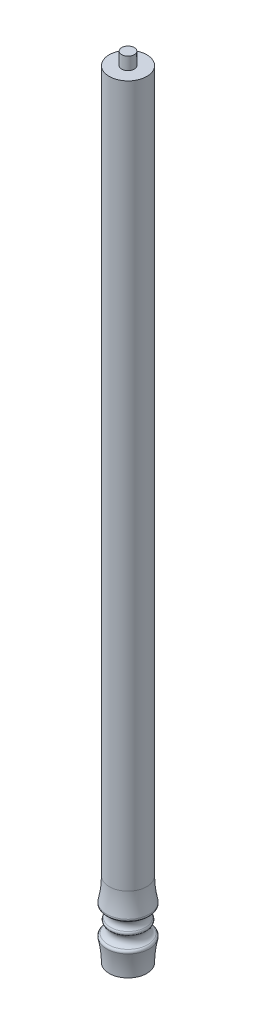
ISO-10303-21;
HEADER;
FILE_DESCRIPTION(('STEP AP214'),'2;1');
FILE_NAME('part.step','',(''),(''),'','','');
FILE_SCHEMA(('AUTOMOTIVE_DESIGN { 1 0 10303 214 1 1 1 1 }'));
ENDSEC;
DATA;
#1=APPLICATION_CONTEXT('core data for automotive mechanical design processes');
#2=APPLICATION_PROTOCOL_DEFINITION('international standard','automotive_design',2000,#1);
#3=PRODUCT_CONTEXT('',#1,'mechanical');
#4=PRODUCT('Part','Part','',(#3));
#5=PRODUCT_RELATED_PRODUCT_CATEGORY('part','',(#4));
#6=PRODUCT_DEFINITION_FORMATION('','',#4);
#7=PRODUCT_DEFINITION_CONTEXT('part definition',#1,'design');
#8=PRODUCT_DEFINITION('design','',#6,#7);
#9=PRODUCT_DEFINITION_SHAPE('','',#8);
#10=(LENGTH_UNIT() NAMED_UNIT(*) SI_UNIT(.MILLI.,.METRE.));
#11=(NAMED_UNIT(*) PLANE_ANGLE_UNIT() SI_UNIT($,.RADIAN.));
#12=(NAMED_UNIT(*) SI_UNIT($,.STERADIAN.) SOLID_ANGLE_UNIT());
#13=UNCERTAINTY_MEASURE_WITH_UNIT(LENGTH_MEASURE(1.E-05),#10,'distance_accuracy_value','');
#14=(GEOMETRIC_REPRESENTATION_CONTEXT(3) GLOBAL_UNCERTAINTY_ASSIGNED_CONTEXT((#13)) GLOBAL_UNIT_ASSIGNED_CONTEXT((#10,
#11,#12)) REPRESENTATION_CONTEXT('',''));
#15=CARTESIAN_POINT('',(0.,0.,0.));
#16=DIRECTION('',(0.,0.,1.));
#17=DIRECTION('',(1.,0.,0.));
#18=AXIS2_PLACEMENT_3D('',#15,#16,#17);
#19=CARTESIAN_POINT('',(6.35,800.1,0.));
#20=DIRECTION('',(0.,1.,0.));
#21=DIRECTION('',(0.,0.,1.));
#22=AXIS2_PLACEMENT_3D('',#19,#20,#21);
#23=PLANE('',#22);
#24=CARTESIAN_POINT('',(0.,800.1,0.));
#25=DIRECTION('',(0.,-1.,0.));
#26=DIRECTION('',(0.,0.,-1.));
#27=AXIS2_PLACEMENT_3D('',#24,#25,#26);
#28=CIRCLE('',#27,6.35);
#29=CARTESIAN_POINT('',(0.,800.1,-6.35));
#30=VERTEX_POINT('',#29);
#31=EDGE_CURVE('E10',#30,#30,#28,.T.);
#32=ORIENTED_EDGE('',*,*,#31,.F.);
#33=EDGE_LOOP('',(#32));
#34=FACE_BOUND('',#33,.T.);
#35=ADVANCED_FACE('F31',(#34),#23,.T.);
#36=CARTESIAN_POINT('',(0.,-55.,0.));
#37=DIRECTION('',(0.,-1.,0.));
#38=DIRECTION('',(0.,0.,-1.));
#39=AXIS2_PLACEMENT_3D('',#36,#37,#38);
#40=CYLINDRICAL_SURFACE('',#39,6.35);
#41=ORIENTED_EDGE('',*,*,#31,.T.);
#42=EDGE_LOOP('',(#41));
#43=FACE_BOUND('',#42,.T.);
#44=CARTESIAN_POINT('',(0.,787.4,0.));
#45=DIRECTION('',(0.,-1.,0.));
#46=DIRECTION('',(0.,0.,-1.));
#47=AXIS2_PLACEMENT_3D('',#44,#45,#46);
#48=CIRCLE('',#47,6.35);
#49=CARTESIAN_POINT('',(0.,787.4,-6.35));
#50=VERTEX_POINT('',#49);
#51=EDGE_CURVE('E37',#50,#50,#48,.T.);
#52=ORIENTED_EDGE('',*,*,#51,.F.);
#53=EDGE_LOOP('',(#52));
#54=FACE_BOUND('',#53,.T.);
#55=ADVANCED_FACE('F88',(#43,#54),#40,.T.);
#56=CARTESIAN_POINT('',(19.05,787.4,0.));
#57=DIRECTION('',(0.,1.,0.));
#58=DIRECTION('',(0.,0.,1.));
#59=AXIS2_PLACEMENT_3D('',#56,#57,#58);
#60=PLANE('',#59);
#61=ORIENTED_EDGE('',*,*,#51,.T.);
#62=EDGE_LOOP('',(#61));
#63=FACE_BOUND('',#62,.T.);
#64=CARTESIAN_POINT('',(0.,787.4,0.));
#65=DIRECTION('',(0.,-1.,0.));
#66=DIRECTION('',(0.,0.,-1.));
#67=AXIS2_PLACEMENT_3D('',#64,#65,#66);
#68=CIRCLE('',#67,19.05);
#69=CARTESIAN_POINT('',(0.,787.4,-19.05));
#70=VERTEX_POINT('',#69);
#71=EDGE_CURVE('E41',#70,#70,#68,.T.);
#72=ORIENTED_EDGE('',*,*,#71,.F.);
#73=EDGE_LOOP('',(#72));
#74=FACE_BOUND('',#73,.T.);
#75=ADVANCED_FACE('F93',(#63,#74),#60,.T.);
#76=CARTESIAN_POINT('',(0.,-55.,0.));
#77=DIRECTION('',(0.,-1.,0.));
#78=DIRECTION('',(0.,0.,-1.));
#79=AXIS2_PLACEMENT_3D('',#76,#77,#78);
#80=CYLINDRICAL_SURFACE('',#79,19.05);
#81=ORIENTED_EDGE('',*,*,#71,.T.);
#82=EDGE_LOOP('',(#81));
#83=FACE_BOUND('',#82,.T.);
#84=CARTESIAN_POINT('',(0.,76.2,0.));
#85=DIRECTION('',(0.,-1.,0.));
#86=DIRECTION('',(0.,0.,-1.));
#87=AXIS2_PLACEMENT_3D('',#84,#85,#86);
#88=CIRCLE('',#87,19.05);
#89=CARTESIAN_POINT('',(0.,76.2,-19.05));
#90=VERTEX_POINT('',#89);
#91=EDGE_CURVE('E45',#90,#90,#88,.T.);
#92=ORIENTED_EDGE('',*,*,#91,.F.);
#93=EDGE_LOOP('',(#92));
#94=FACE_BOUND('',#93,.T.);
#95=ADVANCED_FACE('F97',(#83,#94),#80,.T.);
#96=CARTESIAN_POINT('',(0.,76.2,0.));
#97=DIRECTION('',(0.,-1.,0.));
#98=DIRECTION('',(0.,0.,-1.));
#99=AXIS2_PLACEMENT_3D('',#96,#97,#98);
#100=TOROIDAL_SURFACE('',#99,122.2375,103.1875);
#101=ORIENTED_EDGE('',*,*,#91,.T.);
#102=EDGE_LOOP('',(#101));
#103=FACE_BOUND('',#102,.T.);
#104=CARTESIAN_POINT('',(0.,53.348293437608,0.));
#105=DIRECTION('',(0.,-1.,0.));
#106=DIRECTION('',(0.,0.,-1.));
#107=AXIS2_PLACEMENT_3D('',#104,#105,#106);
#108=CIRCLE('',#107,21.6121569524539);
#109=CARTESIAN_POINT('',(0.,53.348293437608,-21.6121569524539));
#110=VERTEX_POINT('',#109);
#111=EDGE_CURVE('E50',#110,#110,#108,.T.);
#112=ORIENTED_EDGE('',*,*,#111,.F.);
#113=EDGE_LOOP('',(#112));
#114=FACE_BOUND('',#113,.T.);
#115=ADVANCED_FACE('F103',(#103,#114),#100,.F.);
#116=CARTESIAN_POINT('',(0.,52.7857898914568,0.));
#117=DIRECTION('',(0.,-1.,0.));
#118=DIRECTION('',(0.,0.,-1.));
#119=AXIS2_PLACEMENT_3D('',#116,#117,#118);
#120=TOROIDAL_SURFACE('',#119,19.1352254312836,2.54);
#121=ORIENTED_EDGE('',*,*,#111,.T.);
#122=EDGE_LOOP('',(#121));
#123=FACE_BOUND('',#122,.T.);
#124=CARTESIAN_POINT('',(0.,50.4041356367548,0.));
#125=DIRECTION('',(0.,-1.,0.));
#126=DIRECTION('',(0.,0.,-1.));
#127=AXIS2_PLACEMENT_3D('',#124,#125,#126);
#128=CIRCLE('',#127,20.0180181652025);
#129=CARTESIAN_POINT('',(0.,50.4041356367548,-20.0180181652025));
#130=VERTEX_POINT('',#129);
#131=EDGE_CURVE('E53',#130,#130,#128,.T.);
#132=ORIENTED_EDGE('',*,*,#131,.F.);
#133=EDGE_LOOP('',(#132));
#134=FACE_BOUND('',#133,.T.);
#135=ADVANCED_FACE('F107',(#123,#134),#120,.T.);
#136=CARTESIAN_POINT('',(0.,44.45,0.));
#137=DIRECTION('',(0.,-1.,0.));
#138=DIRECTION('',(0.,0.,-1.));
#139=AXIS2_PLACEMENT_3D('',#136,#137,#138);
#140=TOROIDAL_SURFACE('',#139,22.225,6.35);
#141=ORIENTED_EDGE('',*,*,#131,.T.);
#142=EDGE_LOOP('',(#141));
#143=FACE_BOUND('',#142,.T.);
#144=CARTESIAN_POINT('',(0.,39.9142857142857,0.));
#145=DIRECTION('',(0.,-1.,0.));
#146=DIRECTION('',(0.,0.,-1.));
#147=AXIS2_PLACEMENT_3D('',#144,#145,#146);
#148=CIRCLE('',#147,17.7809257523791);
#149=CARTESIAN_POINT('',(0.,39.9142857142857,-17.7809257523791));
#150=VERTEX_POINT('',#149);
#151=EDGE_CURVE('E56',#150,#150,#148,.T.);
#152=ORIENTED_EDGE('',*,*,#151,.F.);
#153=EDGE_LOOP('',(#152));
#154=FACE_BOUND('',#153,.T.);
#155=ADVANCED_FACE('F111',(#143,#154),#140,.F.);
#156=CARTESIAN_POINT('',(0.,38.1,0.));
#157=DIRECTION('',(0.,-1.,0.));
#158=DIRECTION('',(0.,0.,-1.));
#159=AXIS2_PLACEMENT_3D('',#156,#157,#158);
#160=TOROIDAL_SURFACE('',#159,16.0032960533307,2.54);
#161=ORIENTED_EDGE('',*,*,#151,.T.);
#162=EDGE_LOOP('',(#161));
#163=FACE_BOUND('',#162,.T.);
#164=CARTESIAN_POINT('',(0.,36.2857142857143,0.));
#165=DIRECTION('',(0.,-1.,0.));
#166=DIRECTION('',(0.,0.,-1.));
#167=AXIS2_PLACEMENT_3D('',#164,#165,#166);
#168=CIRCLE('',#167,17.7809257523791);
#169=CARTESIAN_POINT('',(0.,36.2857142857143,-17.7809257523791));
#170=VERTEX_POINT('',#169);
#171=EDGE_CURVE('E59',#170,#170,#168,.T.);
#172=ORIENTED_EDGE('',*,*,#171,.F.);
#173=EDGE_LOOP('',(#172));
#174=FACE_BOUND('',#173,.T.);
#175=ADVANCED_FACE('F115',(#163,#174),#160,.T.);
#176=CARTESIAN_POINT('',(0.,31.75,0.));
#177=DIRECTION('',(0.,-1.,0.));
#178=DIRECTION('',(0.,0.,-1.));
#179=AXIS2_PLACEMENT_3D('',#176,#177,#178);
#180=TOROIDAL_SURFACE('',#179,22.225,6.34999999999999);
#181=ORIENTED_EDGE('',*,*,#171,.T.);
#182=EDGE_LOOP('',(#181));
#183=FACE_BOUND('',#182,.T.);
#184=CARTESIAN_POINT('',(0.,25.7958643632452,0.));
#185=DIRECTION('',(0.,-1.,0.));
#186=DIRECTION('',(0.,0.,-1.));
#187=AXIS2_PLACEMENT_3D('',#184,#185,#186);
#188=CIRCLE('',#187,20.0180181652026);
#189=CARTESIAN_POINT('',(0.,25.7958643632452,-20.0180181652026));
#190=VERTEX_POINT('',#189);
#191=EDGE_CURVE('E62',#190,#190,#188,.T.);
#192=ORIENTED_EDGE('',*,*,#191,.F.);
#193=EDGE_LOOP('',(#192));
#194=FACE_BOUND('',#193,.T.);
#195=ADVANCED_FACE('F84',(#183,#194),#180,.F.);
#196=CARTESIAN_POINT('',(0.,23.4142101085433,0.));
#197=DIRECTION('',(0.,-1.,0.));
#198=DIRECTION('',(0.,0.,-1.));
#199=AXIS2_PLACEMENT_3D('',#196,#197,#198);
#200=TOROIDAL_SURFACE('',#199,19.1352254312836,2.54);
#201=ORIENTED_EDGE('',*,*,#191,.T.);
#202=EDGE_LOOP('',(#201));
#203=FACE_BOUND('',#202,.T.);
#204=CARTESIAN_POINT('',(0.,22.8517065623921,0.));
#205=DIRECTION('',(0.,-1.,0.));
#206=DIRECTION('',(0.,0.,-1.));
#207=AXIS2_PLACEMENT_3D('',#204,#205,#206);
#208=CIRCLE('',#207,21.6121569524539);
#209=CARTESIAN_POINT('',(0.,22.8517065623921,-21.6121569524539));
#210=VERTEX_POINT('',#209);
#211=EDGE_CURVE('E65',#210,#210,#208,.T.);
#212=ORIENTED_EDGE('',*,*,#211,.F.);
#213=EDGE_LOOP('',(#212));
#214=FACE_BOUND('',#213,.T.);
#215=ADVANCED_FACE('F76',(#203,#214),#200,.T.);
#216=CARTESIAN_POINT('',(0.,0.,0.));
#217=DIRECTION('',(0.,-1.,0.));
#218=DIRECTION('',(0.,0.,-1.));
#219=AXIS2_PLACEMENT_3D('',#216,#217,#218);
#220=TOROIDAL_SURFACE('',#219,122.2375,103.1875);
#221=ORIENTED_EDGE('',*,*,#211,.T.);
#222=EDGE_LOOP('',(#221));
#223=FACE_BOUND('',#222,.T.);
#224=CARTESIAN_POINT('',(0.,0.,0.));
#225=DIRECTION('',(0.,-1.,0.));
#226=DIRECTION('',(0.,0.,-1.));
#227=AXIS2_PLACEMENT_3D('',#224,#225,#226);
#228=CIRCLE('',#227,19.05);
#229=CARTESIAN_POINT('',(0.,0.,-19.05));
#230=VERTEX_POINT('',#229);
#231=EDGE_CURVE('E68',#230,#230,#228,.T.);
#232=ORIENTED_EDGE('',*,*,#231,.F.);
#233=EDGE_LOOP('',(#232));
#234=FACE_BOUND('',#233,.T.);
#235=ADVANCED_FACE('F74',(#223,#234),#220,.F.);
#236=CARTESIAN_POINT('',(0.,0.,0.));
#237=DIRECTION('',(0.,-1.,0.));
#238=DIRECTION('',(0.,0.,-1.));
#239=AXIS2_PLACEMENT_3D('',#236,#237,#238);
#240=PLANE('',#239);
#241=ORIENTED_EDGE('',*,*,#231,.T.);
#242=EDGE_LOOP('',(#241));
#243=FACE_BOUND('',#242,.T.);
#244=ADVANCED_FACE('F72',(#243),#240,.T.);
#245=CLOSED_SHELL('',(#35,#55,#75,#95,#115,#135,#155,#175,#195,#215,#235,#244));
#246=MANIFOLD_SOLID_BREP('B2',#245);
#247=ADVANCED_BREP_SHAPE_REPRESENTATION('',(#18,#246),#14);
#248=SHAPE_DEFINITION_REPRESENTATION(#9,#247);
ENDSEC;
END-ISO-10303-21;
